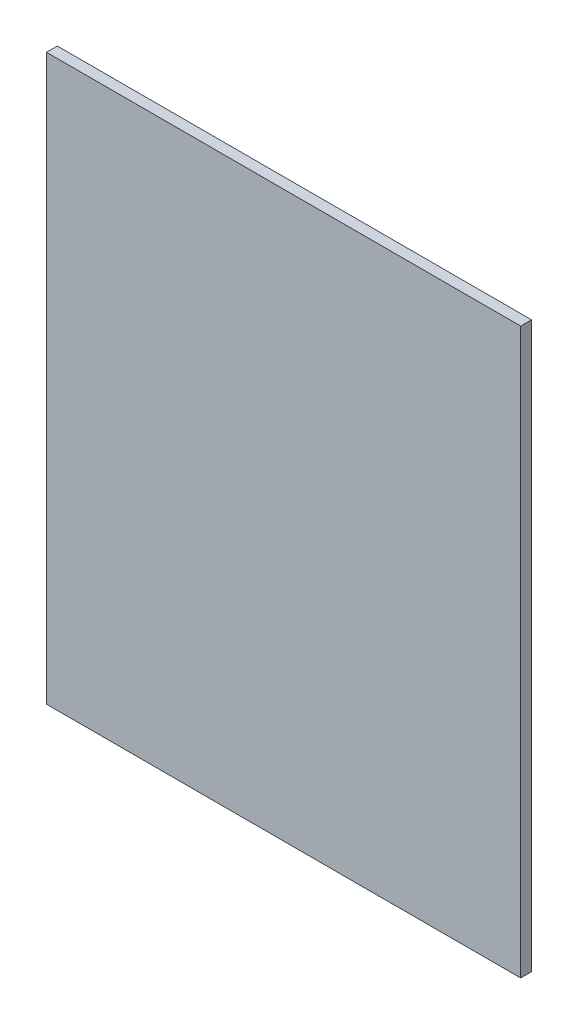
ISO-10303-21;
HEADER;
FILE_DESCRIPTION(('STEP AP214'),'2;1');
FILE_NAME('part.step','',(''),(''),'','','');
FILE_SCHEMA(('AUTOMOTIVE_DESIGN { 1 0 10303 214 1 1 1 1 }'));
ENDSEC;
DATA;
#1=APPLICATION_CONTEXT('core data for automotive mechanical design processes');
#2=APPLICATION_PROTOCOL_DEFINITION('international standard','automotive_design',2000,#1);
#3=PRODUCT_CONTEXT('',#1,'mechanical');
#4=PRODUCT('Part','Part','',(#3));
#5=PRODUCT_RELATED_PRODUCT_CATEGORY('part','',(#4));
#6=PRODUCT_DEFINITION_FORMATION('','',#4);
#7=PRODUCT_DEFINITION_CONTEXT('part definition',#1,'design');
#8=PRODUCT_DEFINITION('design','',#6,#7);
#9=PRODUCT_DEFINITION_SHAPE('','',#8);
#10=(LENGTH_UNIT() NAMED_UNIT(*) SI_UNIT(.MILLI.,.METRE.));
#11=(NAMED_UNIT(*) PLANE_ANGLE_UNIT() SI_UNIT($,.RADIAN.));
#12=(NAMED_UNIT(*) SI_UNIT($,.STERADIAN.) SOLID_ANGLE_UNIT());
#13=UNCERTAINTY_MEASURE_WITH_UNIT(LENGTH_MEASURE(1.E-05),#10,'distance_accuracy_value','');
#14=(GEOMETRIC_REPRESENTATION_CONTEXT(3) GLOBAL_UNCERTAINTY_ASSIGNED_CONTEXT((#13)) GLOBAL_UNIT_ASSIGNED_CONTEXT((#10,
#11,#12)) REPRESENTATION_CONTEXT('',''));
#15=CARTESIAN_POINT('',(0.,0.,0.));
#16=DIRECTION('',(0.,0.,1.));
#17=DIRECTION('',(1.,0.,0.));
#18=AXIS2_PLACEMENT_3D('',#15,#16,#17);
#19=CARTESIAN_POINT('',(-33.3375,-39.6875,10.324));
#20=DIRECTION('',(0.,0.,1.));
#21=DIRECTION('',(1.,0.,0.));
#22=AXIS2_PLACEMENT_3D('',#19,#20,#21);
#23=PLANE('',#22);
#24=DIRECTION('',(0.,-1.,0.));
#25=VECTOR('',#24,1.);
#26=CARTESIAN_POINT('',(33.3375,39.6875,10.324));
#27=LINE('',#26,#25);
#28=CARTESIAN_POINT('',(33.3375,-39.6875,10.324));
#29=VERTEX_POINT('',#28);
#30=CARTESIAN_POINT('',(33.3375,39.6875,10.324));
#31=VERTEX_POINT('',#30);
#32=EDGE_CURVE('E55',#29,#31,#27,.F.);
#33=ORIENTED_EDGE('',*,*,#32,.T.);
#34=DIRECTION('',(1.,0.,0.));
#35=VECTOR('',#34,1.);
#36=CARTESIAN_POINT('',(-33.3375,39.6875,10.324));
#37=LINE('',#36,#35);
#38=CARTESIAN_POINT('',(-33.3375,39.6875,10.324));
#39=VERTEX_POINT('',#38);
#40=EDGE_CURVE('E76',#31,#39,#37,.F.);
#41=ORIENTED_EDGE('',*,*,#40,.T.);
#42=DIRECTION('',(0.,1.,0.));
#43=VECTOR('',#42,1.);
#44=CARTESIAN_POINT('',(-33.3375,39.6875,10.324));
#45=LINE('',#44,#43);
#46=CARTESIAN_POINT('',(-33.3375,-39.6875,10.324));
#47=VERTEX_POINT('',#46);
#48=EDGE_CURVE('E58',#39,#47,#45,.F.);
#49=ORIENTED_EDGE('',*,*,#48,.T.);
#50=DIRECTION('',(1.,0.,0.));
#51=VECTOR('',#50,1.);
#52=CARTESIAN_POINT('',(-33.3375,-39.6875,10.324));
#53=LINE('',#52,#51);
#54=EDGE_CURVE('E20',#47,#29,#53,.T.);
#55=ORIENTED_EDGE('',*,*,#54,.T.);
#56=EDGE_LOOP('',(#33,#41,#49,#55));
#57=FACE_BOUND('',#56,.T.);
#58=ADVANCED_FACE('F17',(#57),#23,.T.);
#59=CARTESIAN_POINT('',(-33.3375,-39.6875,10.324));
#60=DIRECTION('',(0.,1.,0.));
#61=DIRECTION('',(0.,0.,1.));
#62=AXIS2_PLACEMENT_3D('',#59,#60,#61);
#63=PLANE('',#62);
#64=DIRECTION('',(0.,0.,1.));
#65=VECTOR('',#64,1.);
#66=CARTESIAN_POINT('',(33.3375,-39.6875,10.324));
#67=LINE('',#66,#65);
#68=CARTESIAN_POINT('',(33.3375,-39.6875,8.8));
#69=VERTEX_POINT('',#68);
#70=EDGE_CURVE('E63',#69,#29,#67,.T.);
#71=ORIENTED_EDGE('',*,*,#70,.T.);
#72=ORIENTED_EDGE('',*,*,#54,.F.);
#73=DIRECTION('',(0.,0.,1.));
#74=VECTOR('',#73,1.);
#75=CARTESIAN_POINT('',(-33.3375,-39.6875,10.324));
#76=LINE('',#75,#74);
#77=CARTESIAN_POINT('',(-33.3375,-39.6875,8.8));
#78=VERTEX_POINT('',#77);
#79=EDGE_CURVE('E80',#47,#78,#76,.F.);
#80=ORIENTED_EDGE('',*,*,#79,.T.);
#81=DIRECTION('',(1.,0.,0.));
#82=VECTOR('',#81,1.);
#83=CARTESIAN_POINT('',(-33.3375,-39.6875,8.8));
#84=LINE('',#83,#82);
#85=EDGE_CURVE('E73',#78,#69,#84,.T.);
#86=ORIENTED_EDGE('',*,*,#85,.T.);
#87=EDGE_LOOP('',(#71,#72,#80,#86));
#88=FACE_BOUND('',#87,.T.);
#89=ADVANCED_FACE('F72',(#88),#63,.F.);
#90=CARTESIAN_POINT('',(33.3375,39.6875,10.324));
#91=DIRECTION('',(-1.,0.,0.));
#92=DIRECTION('',(0.,-1.,0.));
#93=AXIS2_PLACEMENT_3D('',#90,#91,#92);
#94=PLANE('',#93);
#95=DIRECTION('',(0.,0.,-1.));
#96=VECTOR('',#95,1.);
#97=CARTESIAN_POINT('',(33.3375,39.6875,10.324));
#98=LINE('',#97,#96);
#99=CARTESIAN_POINT('',(33.3375,39.6875,8.8));
#100=VERTEX_POINT('',#99);
#101=EDGE_CURVE('E69',#100,#31,#98,.F.);
#102=ORIENTED_EDGE('',*,*,#101,.T.);
#103=ORIENTED_EDGE('',*,*,#32,.F.);
#104=ORIENTED_EDGE('',*,*,#70,.F.);
#105=DIRECTION('',(0.,1.,0.));
#106=VECTOR('',#105,1.);
#107=CARTESIAN_POINT('',(33.3375,-39.6875,8.8));
#108=LINE('',#107,#106);
#109=EDGE_CURVE('E83',#69,#100,#108,.T.);
#110=ORIENTED_EDGE('',*,*,#109,.T.);
#111=EDGE_LOOP('',(#102,#103,#104,#110));
#112=FACE_BOUND('',#111,.T.);
#113=ADVANCED_FACE('F66',(#112),#94,.F.);
#114=CARTESIAN_POINT('',(-33.3375,39.6875,10.324));
#115=DIRECTION('',(0.,-1.,0.));
#116=DIRECTION('',(0.,0.,-1.));
#117=AXIS2_PLACEMENT_3D('',#114,#115,#116);
#118=PLANE('',#117);
#119=DIRECTION('',(0.,0.,1.));
#120=VECTOR('',#119,1.);
#121=CARTESIAN_POINT('',(-33.3375,39.6875,10.324));
#122=LINE('',#121,#120);
#123=CARTESIAN_POINT('',(-33.3375,39.6875,8.8));
#124=VERTEX_POINT('',#123);
#125=EDGE_CURVE('E34',#124,#39,#122,.T.);
#126=ORIENTED_EDGE('',*,*,#125,.T.);
#127=ORIENTED_EDGE('',*,*,#40,.F.);
#128=ORIENTED_EDGE('',*,*,#101,.F.);
#129=DIRECTION('',(1.,0.,0.));
#130=VECTOR('',#129,1.);
#131=CARTESIAN_POINT('',(-33.3375,39.6875,8.8));
#132=LINE('',#131,#130);
#133=EDGE_CURVE('E26',#100,#124,#132,.F.);
#134=ORIENTED_EDGE('',*,*,#133,.T.);
#135=EDGE_LOOP('',(#126,#127,#128,#134));
#136=FACE_BOUND('',#135,.T.);
#137=ADVANCED_FACE('F88',(#136),#118,.F.);
#138=CARTESIAN_POINT('',(-33.3375,39.6875,10.324));
#139=DIRECTION('',(1.,0.,0.));
#140=DIRECTION('',(0.,1.,0.));
#141=AXIS2_PLACEMENT_3D('',#138,#139,#140);
#142=PLANE('',#141);
#143=ORIENTED_EDGE('',*,*,#79,.F.);
#144=ORIENTED_EDGE('',*,*,#48,.F.);
#145=ORIENTED_EDGE('',*,*,#125,.F.);
#146=DIRECTION('',(0.,1.,0.));
#147=VECTOR('',#146,1.);
#148=CARTESIAN_POINT('',(-33.3375,-39.6875,8.8));
#149=LINE('',#148,#147);
#150=EDGE_CURVE('E11',#124,#78,#149,.F.);
#151=ORIENTED_EDGE('',*,*,#150,.T.);
#152=EDGE_LOOP('',(#143,#144,#145,#151));
#153=FACE_BOUND('',#152,.T.);
#154=ADVANCED_FACE('F91',(#153),#142,.F.);
#155=CARTESIAN_POINT('',(-33.3375,-39.6875,8.8));
#156=DIRECTION('',(0.,0.,1.));
#157=DIRECTION('',(1.,0.,0.));
#158=AXIS2_PLACEMENT_3D('',#155,#156,#157);
#159=PLANE('',#158);
#160=ORIENTED_EDGE('',*,*,#133,.F.);
#161=ORIENTED_EDGE('',*,*,#109,.F.);
#162=ORIENTED_EDGE('',*,*,#85,.F.);
#163=ORIENTED_EDGE('',*,*,#150,.F.);
#164=EDGE_LOOP('',(#160,#161,#162,#163));
#165=FACE_BOUND('',#164,.T.);
#166=ADVANCED_FACE('F90',(#165),#159,.F.);
#167=CLOSED_SHELL('',(#58,#89,#113,#137,#154,#166));
#168=MANIFOLD_SOLID_BREP('B1',#167);
#169=ADVANCED_BREP_SHAPE_REPRESENTATION('',(#18,#168),#14);
#170=SHAPE_DEFINITION_REPRESENTATION(#9,#169);
ENDSEC;
END-ISO-10303-21;
